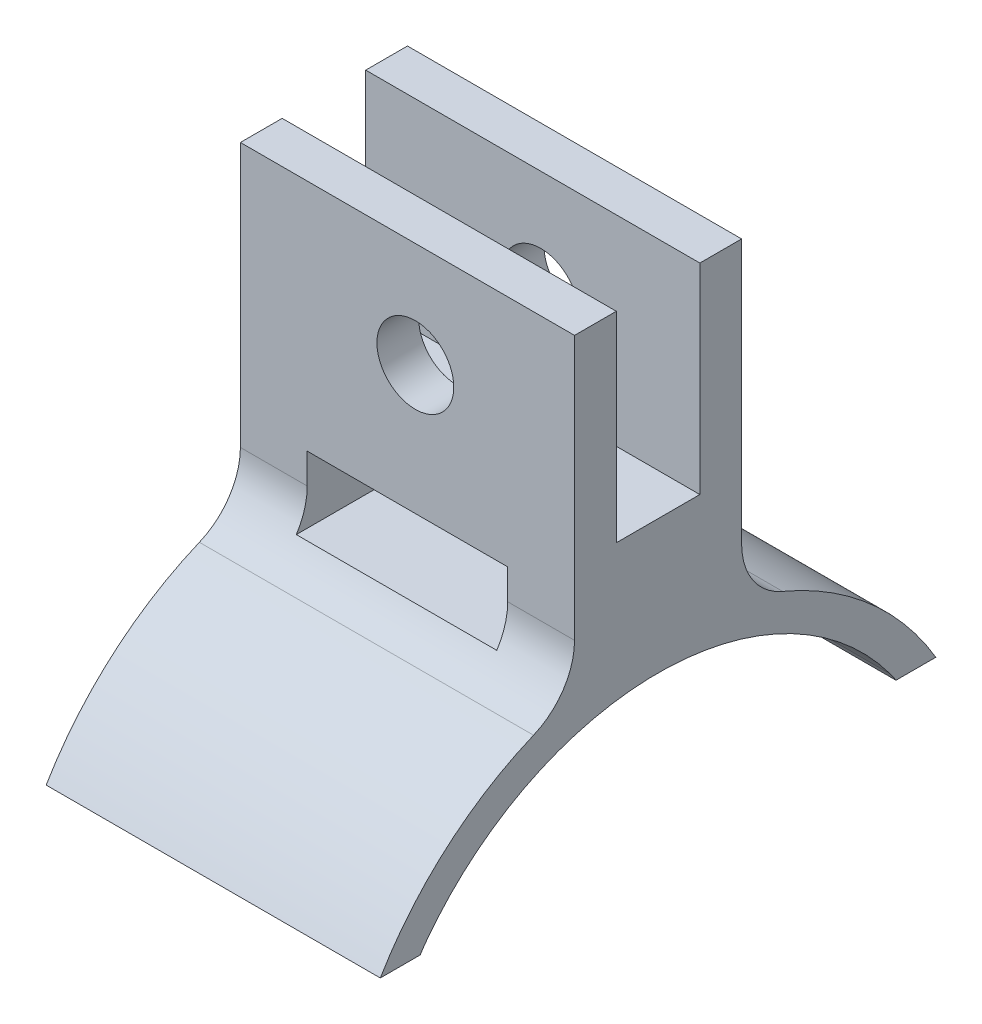
ISO-10303-21;
HEADER;
FILE_DESCRIPTION(('STEP AP214'),'2;1');
FILE_NAME('part.step','',(''),(''),'','','');
FILE_SCHEMA(('AUTOMOTIVE_DESIGN { 1 0 10303 214 1 1 1 1 }'));
ENDSEC;
DATA;
#1=APPLICATION_CONTEXT('core data for automotive mechanical design processes');
#2=APPLICATION_PROTOCOL_DEFINITION('international standard','automotive_design',2000,#1);
#3=PRODUCT_CONTEXT('',#1,'mechanical');
#4=PRODUCT('Part','Part','',(#3));
#5=PRODUCT_RELATED_PRODUCT_CATEGORY('part','',(#4));
#6=PRODUCT_DEFINITION_FORMATION('','',#4);
#7=PRODUCT_DEFINITION_CONTEXT('part definition',#1,'design');
#8=PRODUCT_DEFINITION('design','',#6,#7);
#9=PRODUCT_DEFINITION_SHAPE('','',#8);
#10=(LENGTH_UNIT() NAMED_UNIT(*) SI_UNIT(.MILLI.,.METRE.));
#11=(NAMED_UNIT(*) PLANE_ANGLE_UNIT() SI_UNIT($,.RADIAN.));
#12=(NAMED_UNIT(*) SI_UNIT($,.STERADIAN.) SOLID_ANGLE_UNIT());
#13=UNCERTAINTY_MEASURE_WITH_UNIT(LENGTH_MEASURE(1.E-05),#10,'distance_accuracy_value','');
#14=(GEOMETRIC_REPRESENTATION_CONTEXT(3) GLOBAL_UNCERTAINTY_ASSIGNED_CONTEXT((#13)) GLOBAL_UNIT_ASSIGNED_CONTEXT((#10,
#11,#12)) REPRESENTATION_CONTEXT('',''));
#15=CARTESIAN_POINT('',(0.,0.,0.));
#16=DIRECTION('',(0.,0.,1.));
#17=DIRECTION('',(1.,0.,0.));
#18=AXIS2_PLACEMENT_3D('',#15,#16,#17);
#19=CARTESIAN_POINT('',(25.4,0.,0.));
#20=DIRECTION('',(-1.,0.,0.));
#21=DIRECTION('',(0.,0.,1.));
#22=AXIS2_PLACEMENT_3D('',#19,#20,#21);
#23=CYLINDRICAL_SURFACE('',#22,10.9855);
#24=CARTESIAN_POINT('',(18.750000046,0.,0.));
#25=DIRECTION('',(-1.,0.,0.));
#26=DIRECTION('',(0.,-1.,0.));
#27=AXIS2_PLACEMENT_3D('',#24,#25,#26);
#28=CIRCLE('',#27,10.9855);
#29=CARTESIAN_POINT('',(18.750000046,6.55117722318642,8.81834946236559));
#30=VERTEX_POINT('',#29);
#31=CARTESIAN_POINT('',(18.750000046,6.55117722318641,-8.81834946236559));
#32=VERTEX_POINT('',#31);
#33=EDGE_CURVE('E391',#30,#32,#28,.T.);
#34=ORIENTED_EDGE('',*,*,#33,.F.);
#35=DIRECTION('',(-1.,0.,0.));
#36=VECTOR('',#35,1.);
#37=CARTESIAN_POINT('',(25.4,6.55117722318642,8.81834946236559));
#38=LINE('',#37,#36);
#39=CARTESIAN_POINT('',(6.05000004599999,6.55117722318642,8.81834946236559));
#40=VERTEX_POINT('',#39);
#41=EDGE_CURVE('E249',#30,#40,#38,.T.);
#42=ORIENTED_EDGE('',*,*,#41,.T.);
#43=CARTESIAN_POINT('',(6.05000004599999,0.,0.));
#44=DIRECTION('',(1.,0.,0.));
#45=DIRECTION('',(0.,0.,-1.));
#46=AXIS2_PLACEMENT_3D('',#43,#44,#45);
#47=CIRCLE('',#46,10.9855);
#48=CARTESIAN_POINT('',(6.05000004599999,6.55117722318641,-8.81834946236559));
#49=VERTEX_POINT('',#48);
#50=EDGE_CURVE('E335',#49,#40,#47,.T.);
#51=ORIENTED_EDGE('',*,*,#50,.F.);
#52=DIRECTION('',(-1.,0.,0.));
#53=VECTOR('',#52,1.);
#54=CARTESIAN_POINT('',(25.4,6.55117722318642,-8.81834946236559));
#55=LINE('',#54,#53);
#56=EDGE_CURVE('E251',#49,#32,#55,.F.);
#57=ORIENTED_EDGE('',*,*,#56,.T.);
#58=EDGE_LOOP('',(#34,#42,#51,#57));
#59=FACE_BOUND('',#58,.T.);
#60=ADVANCED_FACE('F34',(#59),#23,.F.);
#61=CARTESIAN_POINT('',(25.4,0.,0.));
#62=DIRECTION('',(-1.,0.,0.));
#63=DIRECTION('',(0.,0.,1.));
#64=AXIS2_PLACEMENT_3D('',#61,#62,#63);
#65=CYLINDRICAL_SURFACE('',#64,12.2555);
#66=DIRECTION('',(-1.,0.,0.));
#67=VECTOR('',#66,1.);
#68=CARTESIAN_POINT('',(25.4,11.3043187051138,-4.73388412017168));
#69=LINE('',#68,#67);
#70=CARTESIAN_POINT('',(6.05000004599999,11.3043187051138,-4.73388412017168));
#71=VERTEX_POINT('',#70);
#72=CARTESIAN_POINT('',(18.750000046,11.3043187051138,-4.73388412017168));
#73=VERTEX_POINT('',#72);
#74=EDGE_CURVE('E202',#71,#73,#69,.F.);
#75=ORIENTED_EDGE('',*,*,#74,.T.);
#76=CARTESIAN_POINT('',(18.750000046,0.,0.));
#77=DIRECTION('',(-1.,0.,0.));
#78=DIRECTION('',(0.,-1.,0.));
#79=AXIS2_PLACEMENT_3D('',#76,#77,#78);
#80=CIRCLE('',#79,12.2555);
#81=CARTESIAN_POINT('',(18.750000046,6.22431870511383,-10.5572314982277));
#82=VERTEX_POINT('',#81);
#83=EDGE_CURVE('E185',#73,#82,#80,.T.);
#84=ORIENTED_EDGE('',*,*,#83,.T.);
#85=DIRECTION('',(-1.,0.,0.));
#86=VECTOR('',#85,1.);
#87=CARTESIAN_POINT('',(25.4,6.22431870511383,-10.5572314982277));
#88=LINE('',#87,#86);
#89=CARTESIAN_POINT('',(6.05000004599999,6.22431870511383,-10.5572314982277));
#90=VERTEX_POINT('',#89);
#91=EDGE_CURVE('E199',#82,#90,#88,.T.);
#92=ORIENTED_EDGE('',*,*,#91,.T.);
#93=CARTESIAN_POINT('',(6.05000004599999,0.,0.));
#94=DIRECTION('',(1.,0.,0.));
#95=DIRECTION('',(0.,0.,-1.));
#96=AXIS2_PLACEMENT_3D('',#93,#94,#95);
#97=CIRCLE('',#96,12.2555);
#98=EDGE_CURVE('E351',#90,#71,#97,.T.);
#99=ORIENTED_EDGE('',*,*,#98,.T.);
#100=EDGE_LOOP('',(#75,#84,#92,#99));
#101=FACE_BOUND('',#100,.T.);
#102=ADVANCED_FACE('F197',(#101),#65,.T.);
#103=DIRECTION('',(-1.,0.,0.));
#104=VECTOR('',#103,1.);
#105=CARTESIAN_POINT('',(25.4,6.22431870511383,10.5572314982277));
#106=LINE('',#105,#104);
#107=CARTESIAN_POINT('',(6.05000004599999,6.22431870511383,10.5572314982277));
#108=VERTEX_POINT('',#107);
#109=CARTESIAN_POINT('',(18.750000046,6.22431870511383,10.5572314982277));
#110=VERTEX_POINT('',#109);
#111=EDGE_CURVE('E210',#108,#110,#106,.F.);
#112=ORIENTED_EDGE('',*,*,#111,.T.);
#113=CARTESIAN_POINT('',(18.750000046,0.,0.));
#114=DIRECTION('',(-1.,0.,0.));
#115=DIRECTION('',(0.,-1.,0.));
#116=AXIS2_PLACEMENT_3D('',#113,#114,#115);
#117=CIRCLE('',#116,12.2555);
#118=CARTESIAN_POINT('',(18.750000046,11.3043187051138,4.73388412017167));
#119=VERTEX_POINT('',#118);
#120=EDGE_CURVE('E49',#110,#119,#117,.T.);
#121=ORIENTED_EDGE('',*,*,#120,.T.);
#122=DIRECTION('',(-1.,0.,0.));
#123=VECTOR('',#122,1.);
#124=CARTESIAN_POINT('',(25.4,11.3043187051138,4.73388412017167));
#125=LINE('',#124,#123);
#126=CARTESIAN_POINT('',(6.05000004599999,11.3043187051138,4.73388412017167));
#127=VERTEX_POINT('',#126);
#128=EDGE_CURVE('E244',#119,#127,#125,.T.);
#129=ORIENTED_EDGE('',*,*,#128,.T.);
#130=CARTESIAN_POINT('',(6.05000004599999,0.,0.));
#131=DIRECTION('',(1.,0.,0.));
#132=DIRECTION('',(0.,0.,-1.));
#133=AXIS2_PLACEMENT_3D('',#130,#131,#132);
#134=CIRCLE('',#133,12.2555);
#135=EDGE_CURVE('E273',#127,#108,#134,.T.);
#136=ORIENTED_EDGE('',*,*,#135,.T.);
#137=EDGE_LOOP('',(#112,#121,#129,#136));
#138=FACE_BOUND('',#137,.T.);
#139=ADVANCED_FACE('F278',(#138),#65,.T.);
#140=CARTESIAN_POINT('',(0.,23.6855,0.));
#141=DIRECTION('',(0.,1.,0.));
#142=DIRECTION('',(0.,0.,1.));
#143=AXIS2_PLACEMENT_3D('',#140,#141,#142);
#144=PLANE('',#143);
#145=DIRECTION('',(0.,0.,1.));
#146=VECTOR('',#145,1.);
#147=CARTESIAN_POINT('',(18.750000046,23.6855,-10.5572314982277));
#148=LINE('',#147,#146);
#149=CARTESIAN_POINT('',(18.750000046,23.6855,-3.17500000000001));
#150=VERTEX_POINT('',#149);
#151=CARTESIAN_POINT('',(18.750000046,23.6855,-1.58750000000001));
#152=VERTEX_POINT('',#151);
#153=EDGE_CURVE('E393',#150,#152,#148,.T.);
#154=ORIENTED_EDGE('',*,*,#153,.F.);
#155=DIRECTION('',(-1.,0.,0.));
#156=VECTOR('',#155,1.);
#157=CARTESIAN_POINT('',(0.,23.6855,-3.175));
#158=LINE('',#157,#156);
#159=CARTESIAN_POINT('',(6.05000004599999,23.6855,-3.175));
#160=VERTEX_POINT('',#159);
#161=EDGE_CURVE('E238',#150,#160,#158,.T.);
#162=ORIENTED_EDGE('',*,*,#161,.T.);
#163=DIRECTION('',(0.,0.,1.));
#164=VECTOR('',#163,1.);
#165=CARTESIAN_POINT('',(6.05000004599999,23.6855,-10.5572314982277));
#166=LINE('',#165,#164);
#167=CARTESIAN_POINT('',(6.05000004599999,23.6855,-1.5875));
#168=VERTEX_POINT('',#167);
#169=EDGE_CURVE('E336',#160,#168,#166,.T.);
#170=ORIENTED_EDGE('',*,*,#169,.T.);
#171=DIRECTION('',(-1.,0.,0.));
#172=VECTOR('',#171,1.);
#173=CARTESIAN_POINT('',(25.401,23.6855,-1.58750000000001));
#174=LINE('',#173,#172);
#175=EDGE_CURVE('E223',#152,#168,#174,.T.);
#176=ORIENTED_EDGE('',*,*,#175,.F.);
#177=EDGE_LOOP('',(#154,#162,#170,#176));
#178=FACE_BOUND('',#177,.T.);
#179=ADVANCED_FACE('F404',(#178),#144,.T.);
#180=CARTESIAN_POINT('',(12.7,19.685,12.2555));
#181=DIRECTION('',(0.,0.,-1.));
#182=DIRECTION('',(-1.,0.,0.));
#183=AXIS2_PLACEMENT_3D('',#180,#181,#182);
#184=CYLINDRICAL_SURFACE('',#183,1.4605);
#185=CARTESIAN_POINT('',(12.7,19.685,-1.5875));
#186=DIRECTION('',(0.,0.,-1.));
#187=DIRECTION('',(-1.,0.,0.));
#188=AXIS2_PLACEMENT_3D('',#185,#186,#187);
#189=CIRCLE('',#188,1.4605);
#190=CARTESIAN_POINT('',(11.2395,19.685,-1.5875));
#191=VERTEX_POINT('',#190);
#192=EDGE_CURVE('E218',#191,#191,#189,.T.);
#193=ORIENTED_EDGE('',*,*,#192,.F.);
#194=EDGE_LOOP('',(#193));
#195=FACE_BOUND('',#194,.T.);
#196=CARTESIAN_POINT('',(12.7,19.685,-3.175));
#197=DIRECTION('',(0.,0.,-1.));
#198=DIRECTION('',(-1.,0.,0.));
#199=AXIS2_PLACEMENT_3D('',#196,#197,#198);
#200=CIRCLE('',#199,1.4605);
#201=CARTESIAN_POINT('',(11.2395,19.685,-3.175));
#202=VERTEX_POINT('',#201);
#203=EDGE_CURVE('E221',#202,#202,#200,.T.);
#204=ORIENTED_EDGE('',*,*,#203,.T.);
#205=EDGE_LOOP('',(#204));
#206=FACE_BOUND('',#205,.T.);
#207=ADVANCED_FACE('F482',(#195,#206),#184,.F.);
#208=CARTESIAN_POINT('',(0.,23.6855,3.175));
#209=DIRECTION('',(0.,0.,-1.));
#210=DIRECTION('',(-1.,0.,0.));
#211=AXIS2_PLACEMENT_3D('',#208,#209,#210);
#212=PLANE('',#211);
#213=DIRECTION('',(1.,0.,0.));
#214=VECTOR('',#213,1.);
#215=CARTESIAN_POINT('',(25.4,13.6471826854483,3.175));
#216=LINE('',#215,#214);
#217=CARTESIAN_POINT('',(16.210000046,13.6471826854483,3.175));
#218=VERTEX_POINT('',#217);
#219=CARTESIAN_POINT('',(18.750000046,13.6471826854483,3.175));
#220=VERTEX_POINT('',#219);
#221=EDGE_CURVE('E240',#218,#220,#216,.T.);
#222=ORIENTED_EDGE('',*,*,#221,.T.);
#223=DIRECTION('',(0.,1.,0.));
#224=VECTOR('',#223,1.);
#225=CARTESIAN_POINT('',(18.750000046,23.6855,3.175));
#226=LINE('',#225,#224);
#227=CARTESIAN_POINT('',(18.750000046,23.6855,3.175));
#228=VERTEX_POINT('',#227);
#229=EDGE_CURVE('E366',#220,#228,#226,.T.);
#230=ORIENTED_EDGE('',*,*,#229,.T.);
#231=DIRECTION('',(1.,0.,0.));
#232=VECTOR('',#231,1.);
#233=CARTESIAN_POINT('',(0.,23.6855,3.175));
#234=LINE('',#233,#232);
#235=CARTESIAN_POINT('',(6.05000004599999,23.6855,3.175));
#236=VERTEX_POINT('',#235);
#237=EDGE_CURVE('E235',#236,#228,#234,.T.);
#238=ORIENTED_EDGE('',*,*,#237,.F.);
#239=DIRECTION('',(0.,-1.,0.));
#240=VECTOR('',#239,1.);
#241=CARTESIAN_POINT('',(6.05000004599999,23.6855,3.175));
#242=LINE('',#241,#240);
#243=CARTESIAN_POINT('',(6.05000004599999,13.6471826854483,3.175));
#244=VERTEX_POINT('',#243);
#245=EDGE_CURVE('E281',#236,#244,#242,.T.);
#246=ORIENTED_EDGE('',*,*,#245,.T.);
#247=CARTESIAN_POINT('',(8.59000004599999,13.6471826854483,3.175));
#248=VERTEX_POINT('',#247);
#249=EDGE_CURVE('E241',#244,#248,#216,.T.);
#250=ORIENTED_EDGE('',*,*,#249,.T.);
#251=DIRECTION('',(0.,-1.,0.));
#252=VECTOR('',#251,1.);
#253=CARTESIAN_POINT('',(8.59000004599999,23.6855,3.175));
#254=LINE('',#253,#252);
#255=CARTESIAN_POINT('',(8.59000004599999,14.7955,3.175));
#256=VERTEX_POINT('',#255);
#257=EDGE_CURVE('E312',#256,#248,#254,.T.);
#258=ORIENTED_EDGE('',*,*,#257,.F.);
#259=DIRECTION('',(1.,0.,0.));
#260=VECTOR('',#259,1.);
#261=CARTESIAN_POINT('',(0.,14.7955,3.175));
#262=LINE('',#261,#260);
#263=CARTESIAN_POINT('',(16.210000046,14.7955,3.175));
#264=VERTEX_POINT('',#263);
#265=EDGE_CURVE('E326',#256,#264,#262,.T.);
#266=ORIENTED_EDGE('',*,*,#265,.T.);
#267=DIRECTION('',(0.,-1.,0.));
#268=VECTOR('',#267,1.);
#269=CARTESIAN_POINT('',(16.210000046,23.6855,3.175));
#270=LINE('',#269,#268);
#271=EDGE_CURVE('E323',#264,#218,#270,.T.);
#272=ORIENTED_EDGE('',*,*,#271,.T.);
#273=EDGE_LOOP('',(#222,#230,#238,#246,#250,#258,#266,#272));
#274=FACE_BOUND('',#273,.T.);
#275=CARTESIAN_POINT('',(12.7,19.685,3.175));
#276=DIRECTION('',(0.,0.,-1.));
#277=DIRECTION('',(-1.,0.,0.));
#278=AXIS2_PLACEMENT_3D('',#275,#276,#277);
#279=CIRCLE('',#278,1.4605);
#280=CARTESIAN_POINT('',(11.2395,19.685,3.175));
#281=VERTEX_POINT('',#280);
#282=EDGE_CURVE('E232',#281,#281,#279,.T.);
#283=ORIENTED_EDGE('',*,*,#282,.T.);
#284=EDGE_LOOP('',(#283));
#285=FACE_BOUND('',#284,.T.);
#286=ADVANCED_FACE('F362',(#274,#285),#212,.F.);
#287=CARTESIAN_POINT('',(0.,23.6855,-3.175));
#288=DIRECTION('',(0.,0.,1.));
#289=DIRECTION('',(1.,0.,0.));
#290=AXIS2_PLACEMENT_3D('',#287,#288,#289);
#291=PLANE('',#290);
#292=ORIENTED_EDGE('',*,*,#203,.F.);
#293=EDGE_LOOP('',(#292));
#294=FACE_BOUND('',#293,.T.);
#295=ORIENTED_EDGE('',*,*,#161,.F.);
#296=DIRECTION('',(0.,-1.,0.));
#297=VECTOR('',#296,1.);
#298=CARTESIAN_POINT('',(18.750000046,23.6855,-3.17500000000001));
#299=LINE('',#298,#297);
#300=CARTESIAN_POINT('',(18.750000046,13.6471826854483,-3.17500000000001));
#301=VERTEX_POINT('',#300);
#302=EDGE_CURVE('E204',#150,#301,#299,.T.);
#303=ORIENTED_EDGE('',*,*,#302,.T.);
#304=DIRECTION('',(1.,0.,0.));
#305=VECTOR('',#304,1.);
#306=CARTESIAN_POINT('',(0.,13.6471826854483,-3.175));
#307=LINE('',#306,#305);
#308=CARTESIAN_POINT('',(16.210000046,13.6471826854483,-3.17500000000001));
#309=VERTEX_POINT('',#308);
#310=EDGE_CURVE('E247',#301,#309,#307,.F.);
#311=ORIENTED_EDGE('',*,*,#310,.T.);
#312=DIRECTION('',(0.,1.,0.));
#313=VECTOR('',#312,1.);
#314=CARTESIAN_POINT('',(16.210000046,23.6855,-3.17500000000001));
#315=LINE('',#314,#313);
#316=CARTESIAN_POINT('',(16.210000046,14.7955,-3.175));
#317=VERTEX_POINT('',#316);
#318=EDGE_CURVE('E317',#309,#317,#315,.T.);
#319=ORIENTED_EDGE('',*,*,#318,.T.);
#320=DIRECTION('',(-1.,0.,0.));
#321=VECTOR('',#320,1.);
#322=CARTESIAN_POINT('',(0.,14.7955,-3.175));
#323=LINE('',#322,#321);
#324=CARTESIAN_POINT('',(8.59000004599999,14.7955,-3.175));
#325=VERTEX_POINT('',#324);
#326=EDGE_CURVE('E262',#317,#325,#323,.T.);
#327=ORIENTED_EDGE('',*,*,#326,.T.);
#328=DIRECTION('',(0.,1.,0.));
#329=VECTOR('',#328,1.);
#330=CARTESIAN_POINT('',(8.59000004599999,23.6855,-3.175));
#331=LINE('',#330,#329);
#332=CARTESIAN_POINT('',(8.59000004599999,13.6471826854483,-3.17500000000001));
#333=VERTEX_POINT('',#332);
#334=EDGE_CURVE('E308',#333,#325,#331,.T.);
#335=ORIENTED_EDGE('',*,*,#334,.F.);
#336=CARTESIAN_POINT('',(6.05000004599999,13.6471826854483,-3.17500000000001));
#337=VERTEX_POINT('',#336);
#338=EDGE_CURVE('E246',#333,#337,#307,.F.);
#339=ORIENTED_EDGE('',*,*,#338,.T.);
#340=DIRECTION('',(0.,1.,0.));
#341=VECTOR('',#340,1.);
#342=CARTESIAN_POINT('',(6.05000004599999,23.6855,-3.175));
#343=LINE('',#342,#341);
#344=EDGE_CURVE('E348',#337,#160,#343,.T.);
#345=ORIENTED_EDGE('',*,*,#344,.T.);
#346=EDGE_LOOP('',(#295,#303,#311,#319,#327,#335,#339,#345));
#347=FACE_BOUND('',#346,.T.);
#348=ADVANCED_FACE('F408',(#294,#347),#291,.F.);
#349=CARTESIAN_POINT('',(18.750000046,23.6855,1.58749999999999));
#350=VERTEX_POINT('',#349);
#351=EDGE_CURVE('E193',#350,#228,#148,.T.);
#352=ORIENTED_EDGE('',*,*,#351,.F.);
#353=DIRECTION('',(-1.,0.,0.));
#354=VECTOR('',#353,1.);
#355=CARTESIAN_POINT('',(25.401,23.6855,1.58749999999999));
#356=LINE('',#355,#354);
#357=CARTESIAN_POINT('',(6.05000004599999,23.6855,1.5875));
#358=VERTEX_POINT('',#357);
#359=EDGE_CURVE('E225',#350,#358,#356,.T.);
#360=ORIENTED_EDGE('',*,*,#359,.T.);
#361=EDGE_CURVE('E340',#358,#236,#166,.T.);
#362=ORIENTED_EDGE('',*,*,#361,.T.);
#363=ORIENTED_EDGE('',*,*,#237,.T.);
#364=EDGE_LOOP('',(#352,#360,#362,#363));
#365=FACE_BOUND('',#364,.T.);
#366=ADVANCED_FACE('F369',(#365),#144,.T.);
#367=CARTESIAN_POINT('',(12.7,19.685,1.58749999999999));
#368=DIRECTION('',(0.,0.,1.));
#369=DIRECTION('',(1.,0.,0.));
#370=AXIS2_PLACEMENT_3D('',#367,#368,#369);
#371=CIRCLE('',#370,1.4605);
#372=CARTESIAN_POINT('',(14.1605,19.685,1.58749999999999));
#373=VERTEX_POINT('',#372);
#374=EDGE_CURVE('E222',#373,#373,#371,.T.);
#375=ORIENTED_EDGE('',*,*,#374,.F.);
#376=EDGE_LOOP('',(#375));
#377=FACE_BOUND('',#376,.T.);
#378=ORIENTED_EDGE('',*,*,#282,.F.);
#379=EDGE_LOOP('',(#378));
#380=FACE_BOUND('',#379,.T.);
#381=ADVANCED_FACE('F478',(#377,#380),#184,.F.);
#382=CARTESIAN_POINT('',(25.401,23.6855,-1.58750000000001));
#383=DIRECTION('',(0.,0.,-1.));
#384=DIRECTION('',(-1.,0.,0.));
#385=AXIS2_PLACEMENT_3D('',#382,#383,#384);
#386=PLANE('',#385);
#387=DIRECTION('',(-1.,0.,0.));
#388=VECTOR('',#387,1.);
#389=CARTESIAN_POINT('',(25.401,16.0655,-1.58750000000001));
#390=LINE('',#389,#388);
#391=CARTESIAN_POINT('',(18.750000046,16.0655,-1.58750000000001));
#392=VERTEX_POINT('',#391);
#393=CARTESIAN_POINT('',(6.05000004599999,16.0655,-1.58750000000001));
#394=VERTEX_POINT('',#393);
#395=EDGE_CURVE('E209',#392,#394,#390,.T.);
#396=ORIENTED_EDGE('',*,*,#395,.F.);
#397=DIRECTION('',(0.,1.,0.));
#398=VECTOR('',#397,1.);
#399=CARTESIAN_POINT('',(18.750000046,23.6855,-1.58750000000001));
#400=LINE('',#399,#398);
#401=EDGE_CURVE('E372',#392,#152,#400,.T.);
#402=ORIENTED_EDGE('',*,*,#401,.T.);
#403=ORIENTED_EDGE('',*,*,#175,.T.);
#404=DIRECTION('',(0.,-1.,0.));
#405=VECTOR('',#404,1.);
#406=CARTESIAN_POINT('',(6.05000004599999,23.6855,-1.5875));
#407=LINE('',#406,#405);
#408=EDGE_CURVE('E293',#168,#394,#407,.T.);
#409=ORIENTED_EDGE('',*,*,#408,.T.);
#410=EDGE_LOOP('',(#396,#402,#403,#409));
#411=FACE_BOUND('',#410,.T.);
#412=ORIENTED_EDGE('',*,*,#192,.T.);
#413=EDGE_LOOP('',(#412));
#414=FACE_BOUND('',#413,.T.);
#415=ADVANCED_FACE('F401',(#411,#414),#386,.F.);
#416=CARTESIAN_POINT('',(25.401,23.6855,1.58749999999999));
#417=DIRECTION('',(0.,0.,1.));
#418=DIRECTION('',(1.,0.,0.));
#419=AXIS2_PLACEMENT_3D('',#416,#417,#418);
#420=PLANE('',#419);
#421=ORIENTED_EDGE('',*,*,#359,.F.);
#422=DIRECTION('',(0.,-1.,0.));
#423=VECTOR('',#422,1.);
#424=CARTESIAN_POINT('',(18.750000046,23.6855,1.58749999999999));
#425=LINE('',#424,#423);
#426=CARTESIAN_POINT('',(18.750000046,16.0655,1.5875));
#427=VERTEX_POINT('',#426);
#428=EDGE_CURVE('E376',#350,#427,#425,.T.);
#429=ORIENTED_EDGE('',*,*,#428,.T.);
#430=DIRECTION('',(-1.,0.,0.));
#431=VECTOR('',#430,1.);
#432=CARTESIAN_POINT('',(25.401,16.0655,1.58749999999999));
#433=LINE('',#432,#431);
#434=CARTESIAN_POINT('',(6.05000004599999,16.0655,1.5875));
#435=VERTEX_POINT('',#434);
#436=EDGE_CURVE('E212',#427,#435,#433,.T.);
#437=ORIENTED_EDGE('',*,*,#436,.T.);
#438=DIRECTION('',(0.,1.,0.));
#439=VECTOR('',#438,1.);
#440=CARTESIAN_POINT('',(6.05000004599999,23.6855,1.5875));
#441=LINE('',#440,#439);
#442=EDGE_CURVE('E284',#435,#358,#441,.T.);
#443=ORIENTED_EDGE('',*,*,#442,.T.);
#444=EDGE_LOOP('',(#421,#429,#437,#443));
#445=FACE_BOUND('',#444,.T.);
#446=ORIENTED_EDGE('',*,*,#374,.T.);
#447=EDGE_LOOP('',(#446));
#448=FACE_BOUND('',#447,.T.);
#449=ADVANCED_FACE('F469',(#445,#448),#420,.F.);
#450=CARTESIAN_POINT('',(25.401,16.0655,-1.58750000000001));
#451=DIRECTION('',(0.,-1.,0.));
#452=DIRECTION('',(0.,0.,-1.));
#453=AXIS2_PLACEMENT_3D('',#450,#451,#452);
#454=PLANE('',#453);
#455=ORIENTED_EDGE('',*,*,#436,.F.);
#456=DIRECTION('',(0.,0.,-1.));
#457=VECTOR('',#456,1.);
#458=CARTESIAN_POINT('',(18.750000046,16.0655,-1.58750000000001));
#459=LINE('',#458,#457);
#460=EDGE_CURVE('E379',#427,#392,#459,.T.);
#461=ORIENTED_EDGE('',*,*,#460,.T.);
#462=ORIENTED_EDGE('',*,*,#395,.T.);
#463=DIRECTION('',(0.,0.,1.));
#464=VECTOR('',#463,1.);
#465=CARTESIAN_POINT('',(6.05000004599999,16.0655,-1.58750000000001));
#466=LINE('',#465,#464);
#467=EDGE_CURVE('E280',#394,#435,#466,.T.);
#468=ORIENTED_EDGE('',*,*,#467,.T.);
#469=EDGE_LOOP('',(#455,#461,#462,#468));
#470=FACE_BOUND('',#469,.T.);
#471=ADVANCED_FACE('F452',(#470),#454,.F.);
#472=CARTESIAN_POINT('',(25.4,13.6471826854483,5.715));
#473=DIRECTION('',(-1.,0.,0.));
#474=DIRECTION('',(0.,0.,1.));
#475=AXIS2_PLACEMENT_3D('',#472,#473,#474);
#476=CYLINDRICAL_SURFACE('',#475,2.54);
#477=ORIENTED_EDGE('',*,*,#128,.F.);
#478=CARTESIAN_POINT('',(18.750000046,13.6471826854483,5.715));
#479=DIRECTION('',(-1.,0.,0.));
#480=DIRECTION('',(0.,-1.,0.));
#481=AXIS2_PLACEMENT_3D('',#478,#479,#480);
#482=CIRCLE('',#481,2.54);
#483=EDGE_CURVE('E203',#119,#220,#482,.F.);
#484=ORIENTED_EDGE('',*,*,#483,.T.);
#485=ORIENTED_EDGE('',*,*,#221,.F.);
#486=CARTESIAN_POINT('',(16.210000046,13.6471826854483,5.715));
#487=DIRECTION('',(1.,0.,0.));
#488=DIRECTION('',(0.,0.,-1.));
#489=AXIS2_PLACEMENT_3D('',#486,#487,#488);
#490=CIRCLE('',#489,2.54);
#491=CARTESIAN_POINT('',(16.210000046,12.2555,3.59018958421618));
#492=VERTEX_POINT('',#491);
#493=EDGE_CURVE('E320',#218,#492,#490,.F.);
#494=ORIENTED_EDGE('',*,*,#493,.T.);
#495=DIRECTION('',(-1.,0.,0.));
#496=VECTOR('',#495,1.);
#497=CARTESIAN_POINT('',(25.4,12.2555,3.59018958421618));
#498=LINE('',#497,#496);
#499=CARTESIAN_POINT('',(8.59000004599999,12.2555,3.59018958421618));
#500=VERTEX_POINT('',#499);
#501=EDGE_CURVE('E315',#500,#492,#498,.F.);
#502=ORIENTED_EDGE('',*,*,#501,.F.);
#503=CARTESIAN_POINT('',(8.59000004599999,13.6471826854483,5.715));
#504=DIRECTION('',(1.,0.,0.));
#505=DIRECTION('',(0.,0.,-1.));
#506=AXIS2_PLACEMENT_3D('',#503,#504,#505);
#507=CIRCLE('',#506,2.54);
#508=EDGE_CURVE('E310',#248,#500,#507,.F.);
#509=ORIENTED_EDGE('',*,*,#508,.F.);
#510=ORIENTED_EDGE('',*,*,#249,.F.);
#511=CARTESIAN_POINT('',(6.05000004599999,13.6471826854483,5.715));
#512=DIRECTION('',(1.,0.,0.));
#513=DIRECTION('',(0.,0.,-1.));
#514=AXIS2_PLACEMENT_3D('',#511,#512,#513);
#515=CIRCLE('',#514,2.54);
#516=EDGE_CURVE('E287',#244,#127,#515,.F.);
#517=ORIENTED_EDGE('',*,*,#516,.T.);
#518=EDGE_LOOP('',(#477,#484,#485,#494,#502,#509,#510,#517));
#519=FACE_BOUND('',#518,.T.);
#520=ADVANCED_FACE('F354',(#519),#476,.F.);
#521=CARTESIAN_POINT('',(25.4,13.6471826854483,-5.71500000000001));
#522=DIRECTION('',(-1.,0.,0.));
#523=DIRECTION('',(0.,0.,1.));
#524=AXIS2_PLACEMENT_3D('',#521,#522,#523);
#525=CYLINDRICAL_SURFACE('',#524,2.54);
#526=ORIENTED_EDGE('',*,*,#310,.F.);
#527=CARTESIAN_POINT('',(18.750000046,13.6471826854483,-5.71500000000001));
#528=DIRECTION('',(-1.,0.,0.));
#529=DIRECTION('',(0.,-1.,0.));
#530=AXIS2_PLACEMENT_3D('',#527,#528,#529);
#531=CIRCLE('',#530,2.54);
#532=EDGE_CURVE('E387',#301,#73,#531,.F.);
#533=ORIENTED_EDGE('',*,*,#532,.T.);
#534=ORIENTED_EDGE('',*,*,#74,.F.);
#535=CARTESIAN_POINT('',(6.05000004599999,13.6471826854483,-5.71500000000001));
#536=DIRECTION('',(1.,0.,0.));
#537=DIRECTION('',(0.,0.,-1.));
#538=AXIS2_PLACEMENT_3D('',#535,#536,#537);
#539=CIRCLE('',#538,2.54);
#540=EDGE_CURVE('E345',#71,#337,#539,.F.);
#541=ORIENTED_EDGE('',*,*,#540,.T.);
#542=ORIENTED_EDGE('',*,*,#338,.F.);
#543=CARTESIAN_POINT('',(8.59000004599999,13.6471826854483,-5.71500000000001));
#544=DIRECTION('',(1.,0.,0.));
#545=DIRECTION('',(0.,0.,-1.));
#546=AXIS2_PLACEMENT_3D('',#543,#544,#545);
#547=CIRCLE('',#546,2.54);
#548=CARTESIAN_POINT('',(8.59000004599999,12.2555,-3.59018958421619));
#549=VERTEX_POINT('',#548);
#550=EDGE_CURVE('E254',#549,#333,#547,.F.);
#551=ORIENTED_EDGE('',*,*,#550,.F.);
#552=DIRECTION('',(-1.,0.,0.));
#553=VECTOR('',#552,1.);
#554=CARTESIAN_POINT('',(25.4,12.2555,-3.59018958421619));
#555=LINE('',#554,#553);
#556=CARTESIAN_POINT('',(16.210000046,12.2555,-3.59018958421619));
#557=VERTEX_POINT('',#556);
#558=EDGE_CURVE('E256',#557,#549,#555,.T.);
#559=ORIENTED_EDGE('',*,*,#558,.F.);
#560=CARTESIAN_POINT('',(16.210000046,13.6471826854483,-5.71500000000001));
#561=DIRECTION('',(1.,0.,0.));
#562=DIRECTION('',(0.,0.,-1.));
#563=AXIS2_PLACEMENT_3D('',#560,#561,#562);
#564=CIRCLE('',#563,2.54);
#565=EDGE_CURVE('E259',#557,#309,#564,.F.);
#566=ORIENTED_EDGE('',*,*,#565,.T.);
#567=EDGE_LOOP('',(#526,#533,#534,#541,#542,#551,#559,#566));
#568=FACE_BOUND('',#567,.T.);
#569=ADVANCED_FACE('F414',(#568),#525,.F.);
#570=CARTESIAN_POINT('',(25.4,3.52173110841813,4.7405));
#571=DIRECTION('',(-1.,0.,0.));
#572=DIRECTION('',(0.,0.,1.));
#573=AXIS2_PLACEMENT_3D('',#570,#571,#572);
#574=CYLINDRICAL_SURFACE('',#573,5.08);
#575=ORIENTED_EDGE('',*,*,#41,.F.);
#576=CARTESIAN_POINT('',(18.750000046,3.52173110841813,4.7405));
#577=DIRECTION('',(-1.,0.,0.));
#578=DIRECTION('',(0.,-1.,0.));
#579=AXIS2_PLACEMENT_3D('',#576,#577,#578);
#580=CIRCLE('',#579,5.08);
#581=CARTESIAN_POINT('',(18.750000046,6.22431870511383,9.04194397640915));
#582=VERTEX_POINT('',#581);
#583=EDGE_CURVE('E389',#30,#582,#580,.F.);
#584=ORIENTED_EDGE('',*,*,#583,.T.);
#585=DIRECTION('',(-1.,0.,0.));
#586=VECTOR('',#585,1.);
#587=CARTESIAN_POINT('',(25.4,6.22431870511383,9.04194397640915));
#588=LINE('',#587,#586);
#589=CARTESIAN_POINT('',(6.05000004599999,6.22431870511383,9.04194397640915));
#590=VERTEX_POINT('',#589);
#591=EDGE_CURVE('E56',#582,#590,#588,.T.);
#592=ORIENTED_EDGE('',*,*,#591,.T.);
#593=CARTESIAN_POINT('',(6.05000004599999,3.52173110841813,4.7405));
#594=DIRECTION('',(1.,0.,0.));
#595=DIRECTION('',(0.,0.,-1.));
#596=AXIS2_PLACEMENT_3D('',#593,#594,#595);
#597=CIRCLE('',#596,5.08);
#598=EDGE_CURVE('E276',#590,#40,#597,.F.);
#599=ORIENTED_EDGE('',*,*,#598,.T.);
#600=EDGE_LOOP('',(#575,#584,#592,#599));
#601=FACE_BOUND('',#600,.T.);
#602=ADVANCED_FACE('F454',(#601),#574,.F.);
#603=CARTESIAN_POINT('',(25.4,3.52173110841813,-4.7405));
#604=DIRECTION('',(-1.,0.,0.));
#605=DIRECTION('',(0.,0.,1.));
#606=AXIS2_PLACEMENT_3D('',#603,#604,#605);
#607=CYLINDRICAL_SURFACE('',#606,5.08);
#608=DIRECTION('',(-1.,0.,0.));
#609=VECTOR('',#608,1.);
#610=CARTESIAN_POINT('',(25.4,6.22431870511383,-9.04194397640915));
#611=LINE('',#610,#609);
#612=CARTESIAN_POINT('',(6.05000004599999,6.22431870511383,-9.04194397640915));
#613=VERTEX_POINT('',#612);
#614=CARTESIAN_POINT('',(18.750000046,6.22431870511383,-9.04194397640915));
#615=VERTEX_POINT('',#614);
#616=EDGE_CURVE('E329',#613,#615,#611,.F.);
#617=ORIENTED_EDGE('',*,*,#616,.T.);
#618=CARTESIAN_POINT('',(18.750000046,3.52173110841813,-4.7405));
#619=DIRECTION('',(-1.,0.,0.));
#620=DIRECTION('',(0.,-1.,0.));
#621=AXIS2_PLACEMENT_3D('',#618,#619,#620);
#622=CIRCLE('',#621,5.08);
#623=EDGE_CURVE('E188',#615,#32,#622,.F.);
#624=ORIENTED_EDGE('',*,*,#623,.T.);
#625=ORIENTED_EDGE('',*,*,#56,.F.);
#626=CARTESIAN_POINT('',(6.05000004599999,3.52173110841813,-4.7405));
#627=DIRECTION('',(1.,0.,0.));
#628=DIRECTION('',(0.,0.,-1.));
#629=AXIS2_PLACEMENT_3D('',#626,#627,#628);
#630=CIRCLE('',#629,5.08);
#631=EDGE_CURVE('E333',#49,#613,#630,.F.);
#632=ORIENTED_EDGE('',*,*,#631,.T.);
#633=EDGE_LOOP('',(#617,#624,#625,#632));
#634=FACE_BOUND('',#633,.T.);
#635=ADVANCED_FACE('F36',(#634),#607,.F.);
#636=CARTESIAN_POINT('',(0.,6.22431870511383,-13.517499908));
#637=DIRECTION('',(0.,1.,0.));
#638=DIRECTION('',(0.,0.,1.));
#639=AXIS2_PLACEMENT_3D('',#636,#637,#638);
#640=PLANE('',#639);
#641=ORIENTED_EDGE('',*,*,#91,.F.);
#642=DIRECTION('',(0.,0.,1.));
#643=VECTOR('',#642,1.);
#644=CARTESIAN_POINT('',(18.750000046,6.22431870511383,-10.5572314982277));
#645=LINE('',#644,#643);
#646=EDGE_CURVE('E182',#82,#615,#645,.T.);
#647=ORIENTED_EDGE('',*,*,#646,.T.);
#648=ORIENTED_EDGE('',*,*,#616,.F.);
#649=DIRECTION('',(0.,0.,1.));
#650=VECTOR('',#649,1.);
#651=CARTESIAN_POINT('',(6.05000004599999,6.22431870511383,-10.5572314982277));
#652=LINE('',#651,#650);
#653=EDGE_CURVE('E208',#90,#613,#652,.T.);
#654=ORIENTED_EDGE('',*,*,#653,.F.);
#655=EDGE_LOOP('',(#641,#647,#648,#654));
#656=FACE_BOUND('',#655,.T.);
#657=ADVANCED_FACE('F207',(#656),#640,.F.);
#658=ORIENTED_EDGE('',*,*,#591,.F.);
#659=DIRECTION('',(0.,0.,1.));
#660=VECTOR('',#659,1.);
#661=CARTESIAN_POINT('',(18.750000046,6.22431870511383,-13.517499908));
#662=LINE('',#661,#660);
#663=EDGE_CURVE('E11',#582,#110,#662,.T.);
#664=ORIENTED_EDGE('',*,*,#663,.T.);
#665=ORIENTED_EDGE('',*,*,#111,.F.);
#666=DIRECTION('',(0.,0.,-1.));
#667=VECTOR('',#666,1.);
#668=CARTESIAN_POINT('',(6.05000004599999,6.22431870511383,-13.517499908));
#669=LINE('',#668,#667);
#670=EDGE_CURVE('E42',#108,#590,#669,.T.);
#671=ORIENTED_EDGE('',*,*,#670,.T.);
#672=EDGE_LOOP('',(#658,#664,#665,#671));
#673=FACE_BOUND('',#672,.T.);
#674=ADVANCED_FACE('F267',(#673),#640,.F.);
#675=CARTESIAN_POINT('',(0.,14.7955,-5.715));
#676=DIRECTION('',(0.,1.,0.));
#677=DIRECTION('',(0.,0.,1.));
#678=AXIS2_PLACEMENT_3D('',#675,#676,#677);
#679=PLANE('',#678);
#680=DIRECTION('',(0.,0.,1.));
#681=VECTOR('',#680,1.);
#682=CARTESIAN_POINT('',(8.59000004599999,14.7955,-5.715));
#683=LINE('',#682,#681);
#684=EDGE_CURVE('E299',#325,#256,#683,.T.);
#685=ORIENTED_EDGE('',*,*,#684,.F.);
#686=ORIENTED_EDGE('',*,*,#326,.F.);
#687=DIRECTION('',(0.,0.,1.));
#688=VECTOR('',#687,1.);
#689=CARTESIAN_POINT('',(16.210000046,14.7955,-5.71500000000001));
#690=LINE('',#689,#688);
#691=EDGE_CURVE('E296',#317,#264,#690,.T.);
#692=ORIENTED_EDGE('',*,*,#691,.T.);
#693=ORIENTED_EDGE('',*,*,#265,.F.);
#694=EDGE_LOOP('',(#685,#686,#692,#693));
#695=FACE_BOUND('',#694,.T.);
#696=ADVANCED_FACE('F427',(#695),#679,.F.);
#697=CARTESIAN_POINT('',(16.210000046,0.,-5.71500000000001));
#698=DIRECTION('',(1.,0.,0.));
#699=DIRECTION('',(0.,0.,-1.));
#700=AXIS2_PLACEMENT_3D('',#697,#698,#699);
#701=PLANE('',#700);
#702=ORIENTED_EDGE('',*,*,#691,.F.);
#703=ORIENTED_EDGE('',*,*,#318,.F.);
#704=ORIENTED_EDGE('',*,*,#565,.F.);
#705=DIRECTION('',(0.,0.,1.));
#706=VECTOR('',#705,1.);
#707=CARTESIAN_POINT('',(16.210000046,12.2555,-5.71500000000001));
#708=LINE('',#707,#706);
#709=EDGE_CURVE('E305',#557,#492,#708,.T.);
#710=ORIENTED_EDGE('',*,*,#709,.T.);
#711=ORIENTED_EDGE('',*,*,#493,.F.);
#712=ORIENTED_EDGE('',*,*,#271,.F.);
#713=EDGE_LOOP('',(#702,#703,#704,#710,#711,#712));
#714=FACE_BOUND('',#713,.T.);
#715=ADVANCED_FACE('F419',(#714),#701,.F.);
#716=CARTESIAN_POINT('',(0.,12.2555,-5.715));
#717=DIRECTION('',(0.,1.,0.));
#718=DIRECTION('',(0.,0.,1.));
#719=AXIS2_PLACEMENT_3D('',#716,#717,#718);
#720=PLANE('',#719);
#721=ORIENTED_EDGE('',*,*,#501,.T.);
#722=ORIENTED_EDGE('',*,*,#709,.F.);
#723=ORIENTED_EDGE('',*,*,#558,.T.);
#724=DIRECTION('',(0.,0.,1.));
#725=VECTOR('',#724,1.);
#726=CARTESIAN_POINT('',(8.59000004599999,12.2555,-5.715));
#727=LINE('',#726,#725);
#728=EDGE_CURVE('E302',#549,#500,#727,.T.);
#729=ORIENTED_EDGE('',*,*,#728,.T.);
#730=EDGE_LOOP('',(#721,#722,#723,#729));
#731=FACE_BOUND('',#730,.T.);
#732=ADVANCED_FACE('F422',(#731),#720,.T.);
#733=CARTESIAN_POINT('',(8.59000004599999,0.,-5.715));
#734=DIRECTION('',(1.,0.,0.));
#735=DIRECTION('',(0.,0.,-1.));
#736=AXIS2_PLACEMENT_3D('',#733,#734,#735);
#737=PLANE('',#736);
#738=ORIENTED_EDGE('',*,*,#257,.T.);
#739=ORIENTED_EDGE('',*,*,#508,.T.);
#740=ORIENTED_EDGE('',*,*,#728,.F.);
#741=ORIENTED_EDGE('',*,*,#550,.T.);
#742=ORIENTED_EDGE('',*,*,#334,.T.);
#743=ORIENTED_EDGE('',*,*,#684,.T.);
#744=EDGE_LOOP('',(#738,#739,#740,#741,#742,#743));
#745=FACE_BOUND('',#744,.T.);
#746=ADVANCED_FACE('F429',(#745),#737,.T.);
#747=CARTESIAN_POINT('',(6.05000004599999,6.22431870511383,-10.5572314982277));
#748=DIRECTION('',(1.,0.,0.));
#749=DIRECTION('',(0.,0.,-1.));
#750=AXIS2_PLACEMENT_3D('',#747,#748,#749);
#751=PLANE('',#750);
#752=ORIENTED_EDGE('',*,*,#169,.F.);
#753=ORIENTED_EDGE('',*,*,#344,.F.);
#754=ORIENTED_EDGE('',*,*,#540,.F.);
#755=ORIENTED_EDGE('',*,*,#98,.F.);
#756=ORIENTED_EDGE('',*,*,#653,.T.);
#757=ORIENTED_EDGE('',*,*,#631,.F.);
#758=ORIENTED_EDGE('',*,*,#50,.T.);
#759=ORIENTED_EDGE('',*,*,#598,.F.);
#760=ORIENTED_EDGE('',*,*,#670,.F.);
#761=ORIENTED_EDGE('',*,*,#135,.F.);
#762=ORIENTED_EDGE('',*,*,#516,.F.);
#763=ORIENTED_EDGE('',*,*,#245,.F.);
#764=ORIENTED_EDGE('',*,*,#361,.F.);
#765=ORIENTED_EDGE('',*,*,#442,.F.);
#766=ORIENTED_EDGE('',*,*,#467,.F.);
#767=ORIENTED_EDGE('',*,*,#408,.F.);
#768=EDGE_LOOP('',(#752,#753,#754,#755,#756,#757,#758,#759,#760,#761,#762,#763,#764,#765,#766,#767));
#769=FACE_BOUND('',#768,.T.);
#770=ADVANCED_FACE('F272',(#769),#751,.F.);
#771=CARTESIAN_POINT('',(18.750000046,23.6855,-10.5572314982277));
#772=DIRECTION('',(-1.,0.,0.));
#773=DIRECTION('',(0.,-1.,0.));
#774=AXIS2_PLACEMENT_3D('',#771,#772,#773);
#775=PLANE('',#774);
#776=ORIENTED_EDGE('',*,*,#460,.F.);
#777=ORIENTED_EDGE('',*,*,#428,.F.);
#778=ORIENTED_EDGE('',*,*,#351,.T.);
#779=ORIENTED_EDGE('',*,*,#229,.F.);
#780=ORIENTED_EDGE('',*,*,#483,.F.);
#781=ORIENTED_EDGE('',*,*,#120,.F.);
#782=ORIENTED_EDGE('',*,*,#663,.F.);
#783=ORIENTED_EDGE('',*,*,#583,.F.);
#784=ORIENTED_EDGE('',*,*,#33,.T.);
#785=ORIENTED_EDGE('',*,*,#623,.F.);
#786=ORIENTED_EDGE('',*,*,#646,.F.);
#787=ORIENTED_EDGE('',*,*,#83,.F.);
#788=ORIENTED_EDGE('',*,*,#532,.F.);
#789=ORIENTED_EDGE('',*,*,#302,.F.);
#790=ORIENTED_EDGE('',*,*,#153,.T.);
#791=ORIENTED_EDGE('',*,*,#401,.F.);
#792=EDGE_LOOP('',(#776,#777,#778,#779,#780,#781,#782,#783,#784,#785,#786,#787,#788,#789,#790,#791));
#793=FACE_BOUND('',#792,.T.);
#794=ADVANCED_FACE('F184',(#793),#775,.F.);
#795=CLOSED_SHELL('',(#60,#102,#139,#179,#207,#286,#348,#366,#381,#415,#449,#471,#520,#569,#602,
#635,#657,#674,#696,#715,#732,#746,#770,#794));
#796=MANIFOLD_SOLID_BREP('B2',#795);
#797=ADVANCED_BREP_SHAPE_REPRESENTATION('',(#18,#796),#14);
#798=SHAPE_DEFINITION_REPRESENTATION(#9,#797);
ENDSEC;
END-ISO-10303-21;
